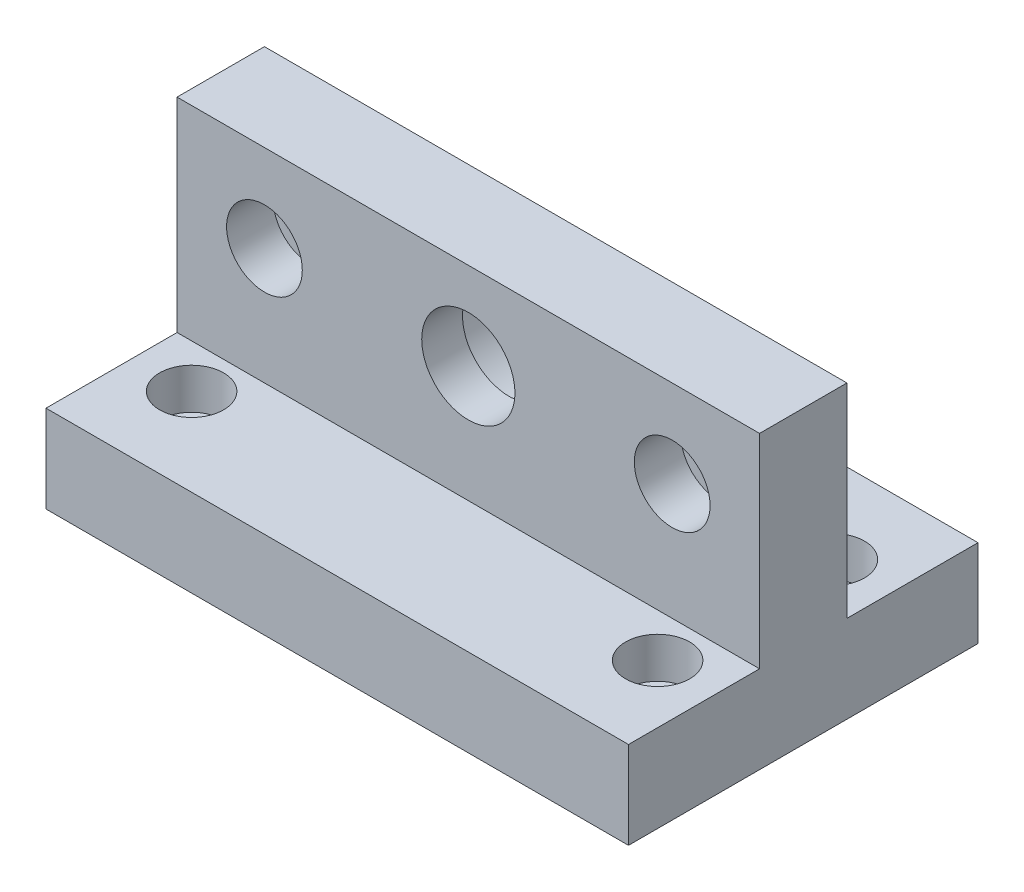
ISO-10303-21;
HEADER;
FILE_DESCRIPTION(('STEP AP214'),'2;1');
FILE_NAME('part.step','',(''),(''),'','','');
FILE_SCHEMA(('AUTOMOTIVE_DESIGN { 1 0 10303 214 1 1 1 1 }'));
ENDSEC;
DATA;
#1=APPLICATION_CONTEXT('core data for automotive mechanical design processes');
#2=APPLICATION_PROTOCOL_DEFINITION('international standard','automotive_design',2000,#1);
#3=PRODUCT_CONTEXT('',#1,'mechanical');
#4=PRODUCT('Part','Part','',(#3));
#5=PRODUCT_RELATED_PRODUCT_CATEGORY('part','',(#4));
#6=PRODUCT_DEFINITION_FORMATION('','',#4);
#7=PRODUCT_DEFINITION_CONTEXT('part definition',#1,'design');
#8=PRODUCT_DEFINITION('design','',#6,#7);
#9=PRODUCT_DEFINITION_SHAPE('','',#8);
#10=(LENGTH_UNIT() NAMED_UNIT(*) SI_UNIT(.MILLI.,.METRE.));
#11=(NAMED_UNIT(*) PLANE_ANGLE_UNIT() SI_UNIT($,.RADIAN.));
#12=(NAMED_UNIT(*) SI_UNIT($,.STERADIAN.) SOLID_ANGLE_UNIT());
#13=UNCERTAINTY_MEASURE_WITH_UNIT(LENGTH_MEASURE(1.E-05),#10,'distance_accuracy_value','');
#14=(GEOMETRIC_REPRESENTATION_CONTEXT(3) GLOBAL_UNCERTAINTY_ASSIGNED_CONTEXT((#13)) GLOBAL_UNIT_ASSIGNED_CONTEXT((#10,
#11,#12)) REPRESENTATION_CONTEXT('',''));
#15=CARTESIAN_POINT('',(0.,0.,0.));
#16=DIRECTION('',(0.,0.,1.));
#17=DIRECTION('',(1.,0.,0.));
#18=AXIS2_PLACEMENT_3D('',#15,#16,#17);
#19=CARTESIAN_POINT('',(85.,20.,37.500025));
#20=DIRECTION('',(0.,0.,-1.));
#21=DIRECTION('',(-1.,0.,0.));
#22=AXIS2_PLACEMENT_3D('',#19,#20,#21);
#23=CYLINDRICAL_SURFACE('',#22,4.5);
#24=CARTESIAN_POINT('',(85.,20.,0.));
#25=DIRECTION('',(0.,0.,-1.));
#26=DIRECTION('',(-1.,0.,0.));
#27=AXIS2_PLACEMENT_3D('',#24,#25,#26);
#28=CIRCLE('',#27,4.5);
#29=CARTESIAN_POINT('',(80.5,20.,0.));
#30=VERTEX_POINT('',#29);
#31=EDGE_CURVE('E341',#30,#30,#28,.T.);
#32=ORIENTED_EDGE('',*,*,#31,.T.);
#33=EDGE_LOOP('',(#32));
#34=FACE_BOUND('',#33,.T.);
#35=CARTESIAN_POINT('',(85.,20.,7.));
#36=DIRECTION('',(0.,0.,1.));
#37=DIRECTION('',(1.,0.,0.));
#38=AXIS2_PLACEMENT_3D('',#35,#36,#37);
#39=CIRCLE('',#38,4.5);
#40=CARTESIAN_POINT('',(89.5,20.,7.));
#41=VERTEX_POINT('',#40);
#42=EDGE_CURVE('E40',#41,#41,#39,.F.);
#43=ORIENTED_EDGE('',*,*,#42,.F.);
#44=EDGE_LOOP('',(#43));
#45=FACE_BOUND('',#44,.T.);
#46=ADVANCED_FACE('F36',(#34,#45),#23,.F.);
#47=CARTESIAN_POINT('',(15.,20.,37.500025));
#48=DIRECTION('',(0.,0.,-1.));
#49=DIRECTION('',(-1.,0.,0.));
#50=AXIS2_PLACEMENT_3D('',#47,#48,#49);
#51=CYLINDRICAL_SURFACE('',#50,4.5);
#52=CARTESIAN_POINT('',(15.,20.,0.));
#53=DIRECTION('',(0.,0.,-1.));
#54=DIRECTION('',(-1.,0.,0.));
#55=AXIS2_PLACEMENT_3D('',#52,#53,#54);
#56=CIRCLE('',#55,4.5);
#57=CARTESIAN_POINT('',(10.5,20.,0.));
#58=VERTEX_POINT('',#57);
#59=EDGE_CURVE('E338',#58,#58,#56,.T.);
#60=ORIENTED_EDGE('',*,*,#59,.T.);
#61=EDGE_LOOP('',(#60));
#62=FACE_BOUND('',#61,.T.);
#63=CARTESIAN_POINT('',(15.,20.,7.));
#64=DIRECTION('',(0.,0.,1.));
#65=DIRECTION('',(1.,0.,0.));
#66=AXIS2_PLACEMENT_3D('',#63,#64,#65);
#67=CIRCLE('',#66,4.5);
#68=CARTESIAN_POINT('',(19.5,20.,7.));
#69=VERTEX_POINT('',#68);
#70=EDGE_CURVE('E315',#69,#69,#67,.F.);
#71=ORIENTED_EDGE('',*,*,#70,.F.);
#72=EDGE_LOOP('',(#71));
#73=FACE_BOUND('',#72,.T.);
#74=ADVANCED_FACE('F216',(#62,#73),#51,.F.);
#75=CARTESIAN_POINT('',(50.,20.,37.500025));
#76=DIRECTION('',(0.,0.,-1.));
#77=DIRECTION('',(-1.,0.,0.));
#78=AXIS2_PLACEMENT_3D('',#75,#76,#77);
#79=CYLINDRICAL_SURFACE('',#78,8.);
#80=CARTESIAN_POINT('',(50.,20.,15.));
#81=DIRECTION('',(0.,0.,-1.));
#82=DIRECTION('',(-1.,0.,0.));
#83=AXIS2_PLACEMENT_3D('',#80,#81,#82);
#84=CIRCLE('',#83,8.);
#85=CARTESIAN_POINT('',(42.,20.,15.));
#86=VERTEX_POINT('',#85);
#87=EDGE_CURVE('E313',#86,#86,#84,.T.);
#88=ORIENTED_EDGE('',*,*,#87,.F.);
#89=EDGE_LOOP('',(#88));
#90=FACE_BOUND('',#89,.T.);
#91=CARTESIAN_POINT('',(50.,20.,8.));
#92=DIRECTION('',(0.,0.,-1.));
#93=DIRECTION('',(-1.,0.,0.));
#94=AXIS2_PLACEMENT_3D('',#91,#92,#93);
#95=CIRCLE('',#94,8.);
#96=CARTESIAN_POINT('',(42.,20.,8.));
#97=VERTEX_POINT('',#96);
#98=EDGE_CURVE('E311',#97,#97,#95,.F.);
#99=ORIENTED_EDGE('',*,*,#98,.F.);
#100=EDGE_LOOP('',(#99));
#101=FACE_BOUND('',#100,.T.);
#102=ADVANCED_FACE('F222',(#90,#101),#79,.F.);
#103=CARTESIAN_POINT('',(90.,-15.,22.5));
#104=DIRECTION('',(0.,1.,0.));
#105=DIRECTION('',(0.,0.,1.));
#106=AXIS2_PLACEMENT_3D('',#103,#104,#105);
#107=CYLINDRICAL_SURFACE('',#106,3.50000000000001);
#108=CARTESIAN_POINT('',(90.,-15.,22.5));
#109=DIRECTION('',(0.,1.,0.));
#110=DIRECTION('',(0.,0.,-1.));
#111=AXIS2_PLACEMENT_3D('',#108,#109,#110);
#112=CIRCLE('',#111,3.50000000000001);
#113=CARTESIAN_POINT('',(90.,-15.,19.));
#114=VERTEX_POINT('',#113);
#115=EDGE_CURVE('E288',#114,#114,#112,.T.);
#116=ORIENTED_EDGE('',*,*,#115,.F.);
#117=EDGE_LOOP('',(#116));
#118=FACE_BOUND('',#117,.T.);
#119=CARTESIAN_POINT('',(90.,-7.,22.5));
#120=DIRECTION('',(0.,1.,0.));
#121=DIRECTION('',(0.,0.,1.));
#122=AXIS2_PLACEMENT_3D('',#119,#120,#121);
#123=CIRCLE('',#122,3.50000000000001);
#124=CARTESIAN_POINT('',(90.,-7.,26.));
#125=VERTEX_POINT('',#124);
#126=EDGE_CURVE('E306',#125,#125,#123,.F.);
#127=ORIENTED_EDGE('',*,*,#126,.F.);
#128=EDGE_LOOP('',(#127));
#129=FACE_BOUND('',#128,.T.);
#130=ADVANCED_FACE('F265',(#118,#129),#107,.F.);
#131=CARTESIAN_POINT('',(9.99999999999998,-15.,22.5));
#132=DIRECTION('',(0.,1.,0.));
#133=DIRECTION('',(0.,0.,1.));
#134=AXIS2_PLACEMENT_3D('',#131,#132,#133);
#135=CYLINDRICAL_SURFACE('',#134,3.5);
#136=CARTESIAN_POINT('',(9.99999999999998,-15.,22.5));
#137=DIRECTION('',(0.,1.,0.));
#138=DIRECTION('',(0.,0.,-1.));
#139=AXIS2_PLACEMENT_3D('',#136,#137,#138);
#140=CIRCLE('',#139,3.5);
#141=CARTESIAN_POINT('',(9.99999999999998,-15.,19.));
#142=VERTEX_POINT('',#141);
#143=EDGE_CURVE('E285',#142,#142,#140,.T.);
#144=ORIENTED_EDGE('',*,*,#143,.F.);
#145=EDGE_LOOP('',(#144));
#146=FACE_BOUND('',#145,.T.);
#147=CARTESIAN_POINT('',(9.99999999999998,-7.,22.5));
#148=DIRECTION('',(0.,1.,0.));
#149=DIRECTION('',(0.,0.,1.));
#150=AXIS2_PLACEMENT_3D('',#147,#148,#149);
#151=CIRCLE('',#150,3.5);
#152=CARTESIAN_POINT('',(9.99999999999998,-7.,26.));
#153=VERTEX_POINT('',#152);
#154=EDGE_CURVE('E301',#153,#153,#151,.F.);
#155=ORIENTED_EDGE('',*,*,#154,.F.);
#156=EDGE_LOOP('',(#155));
#157=FACE_BOUND('',#156,.T.);
#158=ADVANCED_FACE('F261',(#146,#157),#135,.F.);
#159=CARTESIAN_POINT('',(90.,-15.,-7.5));
#160=DIRECTION('',(0.,1.,0.));
#161=DIRECTION('',(0.,0.,1.));
#162=AXIS2_PLACEMENT_3D('',#159,#160,#161);
#163=CYLINDRICAL_SURFACE('',#162,3.50000000000001);
#164=CARTESIAN_POINT('',(90.,-15.,-7.5));
#165=DIRECTION('',(0.,1.,0.));
#166=DIRECTION('',(0.,0.,1.));
#167=AXIS2_PLACEMENT_3D('',#164,#165,#166);
#168=CIRCLE('',#167,3.50000000000001);
#169=CARTESIAN_POINT('',(90.,-15.,-3.99999999999999));
#170=VERTEX_POINT('',#169);
#171=EDGE_CURVE('E359',#170,#170,#168,.T.);
#172=ORIENTED_EDGE('',*,*,#171,.F.);
#173=EDGE_LOOP('',(#172));
#174=FACE_BOUND('',#173,.T.);
#175=CARTESIAN_POINT('',(90.,-7.,-7.5));
#176=DIRECTION('',(0.,1.,0.));
#177=DIRECTION('',(0.,0.,1.));
#178=AXIS2_PLACEMENT_3D('',#175,#176,#177);
#179=CIRCLE('',#178,3.50000000000001);
#180=CARTESIAN_POINT('',(90.,-7.,-3.99999999999999));
#181=VERTEX_POINT('',#180);
#182=EDGE_CURVE('E297',#181,#181,#179,.F.);
#183=ORIENTED_EDGE('',*,*,#182,.F.);
#184=EDGE_LOOP('',(#183));
#185=FACE_BOUND('',#184,.T.);
#186=ADVANCED_FACE('F264',(#174,#185),#163,.F.);
#187=CARTESIAN_POINT('',(10.,-15.,-7.5));
#188=DIRECTION('',(0.,1.,0.));
#189=DIRECTION('',(0.,0.,1.));
#190=AXIS2_PLACEMENT_3D('',#187,#188,#189);
#191=CYLINDRICAL_SURFACE('',#190,3.5);
#192=CARTESIAN_POINT('',(10.,-15.,-7.5));
#193=DIRECTION('',(0.,1.,0.));
#194=DIRECTION('',(0.,0.,1.));
#195=AXIS2_PLACEMENT_3D('',#192,#193,#194);
#196=CIRCLE('',#195,3.5);
#197=CARTESIAN_POINT('',(10.,-15.,-4.));
#198=VERTEX_POINT('',#197);
#199=EDGE_CURVE('E178',#198,#198,#196,.T.);
#200=ORIENTED_EDGE('',*,*,#199,.F.);
#201=EDGE_LOOP('',(#200));
#202=FACE_BOUND('',#201,.T.);
#203=CARTESIAN_POINT('',(10.,-7.,-7.5));
#204=DIRECTION('',(0.,1.,0.));
#205=DIRECTION('',(0.,0.,1.));
#206=AXIS2_PLACEMENT_3D('',#203,#204,#205);
#207=CIRCLE('',#206,3.5);
#208=CARTESIAN_POINT('',(10.,-7.,-4.));
#209=VERTEX_POINT('',#208);
#210=EDGE_CURVE('E283',#209,#209,#207,.F.);
#211=ORIENTED_EDGE('',*,*,#210,.F.);
#212=EDGE_LOOP('',(#211));
#213=FACE_BOUND('',#212,.T.);
#214=ADVANCED_FACE('F271',(#202,#213),#191,.F.);
#215=CARTESIAN_POINT('',(0.,0.,15.));
#216=DIRECTION('',(1.,0.,0.));
#217=DIRECTION('',(0.,0.,-1.));
#218=AXIS2_PLACEMENT_3D('',#215,#216,#217);
#219=PLANE('',#218);
#220=DIRECTION('',(0.,-1.,0.));
#221=VECTOR('',#220,1.);
#222=CARTESIAN_POINT('',(0.,0.,0.));
#223=LINE('',#222,#221);
#224=CARTESIAN_POINT('',(0.,35.,0.));
#225=VERTEX_POINT('',#224);
#226=CARTESIAN_POINT('',(0.,0.,0.));
#227=VERTEX_POINT('',#226);
#228=EDGE_CURVE('E118',#225,#227,#223,.T.);
#229=ORIENTED_EDGE('',*,*,#228,.T.);
#230=DIRECTION('',(0.,0.,-1.));
#231=VECTOR('',#230,1.);
#232=CARTESIAN_POINT('',(0.,0.,37.5));
#233=LINE('',#232,#231);
#234=CARTESIAN_POINT('',(0.,0.,-22.5));
#235=VERTEX_POINT('',#234);
#236=EDGE_CURVE('E149',#227,#235,#233,.T.);
#237=ORIENTED_EDGE('',*,*,#236,.T.);
#238=DIRECTION('',(0.,1.,0.));
#239=VECTOR('',#238,1.);
#240=CARTESIAN_POINT('',(0.,-15.,-22.5));
#241=LINE('',#240,#239);
#242=CARTESIAN_POINT('',(0.,-15.,-22.5));
#243=VERTEX_POINT('',#242);
#244=EDGE_CURVE('E132',#243,#235,#241,.T.);
#245=ORIENTED_EDGE('',*,*,#244,.F.);
#246=DIRECTION('',(0.,0.,-1.));
#247=VECTOR('',#246,1.);
#248=CARTESIAN_POINT('',(0.,-15.,37.5));
#249=LINE('',#248,#247);
#250=CARTESIAN_POINT('',(0.,-15.,37.5));
#251=VERTEX_POINT('',#250);
#252=EDGE_CURVE('E162',#251,#243,#249,.T.);
#253=ORIENTED_EDGE('',*,*,#252,.F.);
#254=DIRECTION('',(0.,1.,0.));
#255=VECTOR('',#254,1.);
#256=CARTESIAN_POINT('',(0.,-15.,37.5));
#257=LINE('',#256,#255);
#258=CARTESIAN_POINT('',(0.,0.,37.5));
#259=VERTEX_POINT('',#258);
#260=EDGE_CURVE('E183',#251,#259,#257,.T.);
#261=ORIENTED_EDGE('',*,*,#260,.T.);
#262=CARTESIAN_POINT('',(0.,0.,15.));
#263=VERTEX_POINT('',#262);
#264=EDGE_CURVE('E146',#259,#263,#233,.T.);
#265=ORIENTED_EDGE('',*,*,#264,.T.);
#266=DIRECTION('',(0.,-1.,0.));
#267=VECTOR('',#266,1.);
#268=CARTESIAN_POINT('',(0.,0.,15.));
#269=LINE('',#268,#267);
#270=CARTESIAN_POINT('',(0.,35.,15.));
#271=VERTEX_POINT('',#270);
#272=EDGE_CURVE('E103',#271,#263,#269,.T.);
#273=ORIENTED_EDGE('',*,*,#272,.F.);
#274=DIRECTION('',(0.,0.,-1.));
#275=VECTOR('',#274,1.);
#276=CARTESIAN_POINT('',(0.,35.,15.));
#277=LINE('',#276,#275);
#278=EDGE_CURVE('E46',#271,#225,#277,.T.);
#279=ORIENTED_EDGE('',*,*,#278,.T.);
#280=EDGE_LOOP('',(#229,#237,#245,#253,#261,#265,#273,#279));
#281=FACE_BOUND('',#280,.T.);
#282=ADVANCED_FACE('F38',(#281),#219,.F.);
#283=CARTESIAN_POINT('',(100.,0.,15.));
#284=DIRECTION('',(-1.,0.,0.));
#285=DIRECTION('',(0.,0.,1.));
#286=AXIS2_PLACEMENT_3D('',#283,#284,#285);
#287=PLANE('',#286);
#288=DIRECTION('',(0.,1.,0.));
#289=VECTOR('',#288,1.);
#290=CARTESIAN_POINT('',(100.,0.,0.));
#291=LINE('',#290,#289);
#292=CARTESIAN_POINT('',(100.,0.,0.));
#293=VERTEX_POINT('',#292);
#294=CARTESIAN_POINT('',(100.,35.,0.));
#295=VERTEX_POINT('',#294);
#296=EDGE_CURVE('E67',#293,#295,#291,.T.);
#297=ORIENTED_EDGE('',*,*,#296,.T.);
#298=DIRECTION('',(0.,0.,-1.));
#299=VECTOR('',#298,1.);
#300=CARTESIAN_POINT('',(100.,35.,15.));
#301=LINE('',#300,#299);
#302=CARTESIAN_POINT('',(100.,35.,15.));
#303=VERTEX_POINT('',#302);
#304=EDGE_CURVE('E11',#303,#295,#301,.T.);
#305=ORIENTED_EDGE('',*,*,#304,.F.);
#306=DIRECTION('',(0.,1.,0.));
#307=VECTOR('',#306,1.);
#308=CARTESIAN_POINT('',(100.,0.,15.));
#309=LINE('',#308,#307);
#310=CARTESIAN_POINT('',(100.,0.,15.));
#311=VERTEX_POINT('',#310);
#312=EDGE_CURVE('E101',#311,#303,#309,.T.);
#313=ORIENTED_EDGE('',*,*,#312,.F.);
#314=DIRECTION('',(0.,0.,1.));
#315=VECTOR('',#314,1.);
#316=CARTESIAN_POINT('',(100.,0.,37.5));
#317=LINE('',#316,#315);
#318=CARTESIAN_POINT('',(100.,0.,37.5));
#319=VERTEX_POINT('',#318);
#320=EDGE_CURVE('E85',#311,#319,#317,.T.);
#321=ORIENTED_EDGE('',*,*,#320,.T.);
#322=DIRECTION('',(0.,1.,0.));
#323=VECTOR('',#322,1.);
#324=CARTESIAN_POINT('',(100.,-15.,37.5));
#325=LINE('',#324,#323);
#326=CARTESIAN_POINT('',(100.,-15.,37.5));
#327=VERTEX_POINT('',#326);
#328=EDGE_CURVE('E142',#327,#319,#325,.T.);
#329=ORIENTED_EDGE('',*,*,#328,.F.);
#330=DIRECTION('',(0.,0.,1.));
#331=VECTOR('',#330,1.);
#332=CARTESIAN_POINT('',(100.,-15.,37.5));
#333=LINE('',#332,#331);
#334=CARTESIAN_POINT('',(100.,-15.,-22.5));
#335=VERTEX_POINT('',#334);
#336=EDGE_CURVE('E175',#335,#327,#333,.T.);
#337=ORIENTED_EDGE('',*,*,#336,.F.);
#338=DIRECTION('',(0.,1.,0.));
#339=VECTOR('',#338,1.);
#340=CARTESIAN_POINT('',(100.,-15.,-22.5));
#341=LINE('',#340,#339);
#342=CARTESIAN_POINT('',(100.,0.,-22.5));
#343=VERTEX_POINT('',#342);
#344=EDGE_CURVE('E134',#335,#343,#341,.T.);
#345=ORIENTED_EDGE('',*,*,#344,.T.);
#346=EDGE_CURVE('E97',#343,#293,#317,.T.);
#347=ORIENTED_EDGE('',*,*,#346,.T.);
#348=EDGE_LOOP('',(#297,#305,#313,#321,#329,#337,#345,#347));
#349=FACE_BOUND('',#348,.T.);
#350=ADVANCED_FACE('F105',(#349),#287,.F.);
#351=CARTESIAN_POINT('',(0.,35.,15.));
#352=DIRECTION('',(0.,-1.,0.));
#353=DIRECTION('',(0.,0.,-1.));
#354=AXIS2_PLACEMENT_3D('',#351,#352,#353);
#355=PLANE('',#354);
#356=DIRECTION('',(-1.,0.,0.));
#357=VECTOR('',#356,1.);
#358=CARTESIAN_POINT('',(0.,35.,0.));
#359=LINE('',#358,#357);
#360=EDGE_CURVE('E113',#295,#225,#359,.T.);
#361=ORIENTED_EDGE('',*,*,#360,.T.);
#362=ORIENTED_EDGE('',*,*,#278,.F.);
#363=DIRECTION('',(-1.,0.,0.));
#364=VECTOR('',#363,1.);
#365=CARTESIAN_POINT('',(0.,35.,15.));
#366=LINE('',#365,#364);
#367=EDGE_CURVE('E55',#303,#271,#366,.T.);
#368=ORIENTED_EDGE('',*,*,#367,.F.);
#369=ORIENTED_EDGE('',*,*,#304,.T.);
#370=EDGE_LOOP('',(#361,#362,#368,#369));
#371=FACE_BOUND('',#370,.T.);
#372=ADVANCED_FACE('F378',(#371),#355,.F.);
#373=CARTESIAN_POINT('',(0.,0.,15.));
#374=DIRECTION('',(0.,0.,-1.));
#375=DIRECTION('',(-1.,0.,0.));
#376=AXIS2_PLACEMENT_3D('',#373,#374,#375);
#377=PLANE('',#376);
#378=CARTESIAN_POINT('',(85.,20.,15.));
#379=DIRECTION('',(0.,0.,1.));
#380=DIRECTION('',(1.,0.,0.));
#381=AXIS2_PLACEMENT_3D('',#378,#379,#380);
#382=CIRCLE('',#381,6.5);
#383=CARTESIAN_POINT('',(91.5,20.,15.));
#384=VERTEX_POINT('',#383);
#385=EDGE_CURVE('E331',#384,#384,#382,.T.);
#386=ORIENTED_EDGE('',*,*,#385,.F.);
#387=EDGE_LOOP('',(#386));
#388=FACE_BOUND('',#387,.T.);
#389=CARTESIAN_POINT('',(15.,20.,15.));
#390=DIRECTION('',(0.,0.,1.));
#391=DIRECTION('',(1.,0.,0.));
#392=AXIS2_PLACEMENT_3D('',#389,#390,#391);
#393=CIRCLE('',#392,6.5);
#394=CARTESIAN_POINT('',(21.5,20.,15.));
#395=VERTEX_POINT('',#394);
#396=EDGE_CURVE('E324',#395,#395,#393,.T.);
#397=ORIENTED_EDGE('',*,*,#396,.F.);
#398=EDGE_LOOP('',(#397));
#399=FACE_BOUND('',#398,.T.);
#400=ORIENTED_EDGE('',*,*,#87,.T.);
#401=EDGE_LOOP('',(#400));
#402=FACE_BOUND('',#401,.T.);
#403=ORIENTED_EDGE('',*,*,#272,.T.);
#404=DIRECTION('',(1.,0.,0.));
#405=VECTOR('',#404,1.);
#406=CARTESIAN_POINT('',(0.,0.,15.));
#407=LINE('',#406,#405);
#408=EDGE_CURVE('E89',#263,#311,#407,.T.);
#409=ORIENTED_EDGE('',*,*,#408,.T.);
#410=ORIENTED_EDGE('',*,*,#312,.T.);
#411=ORIENTED_EDGE('',*,*,#367,.T.);
#412=EDGE_LOOP('',(#403,#409,#410,#411));
#413=FACE_BOUND('',#412,.T.);
#414=ADVANCED_FACE('F100',(#388,#399,#402,#413),#377,.F.);
#415=CARTESIAN_POINT('',(0.,0.,0.));
#416=DIRECTION('',(0.,0.,-1.));
#417=DIRECTION('',(-1.,0.,0.));
#418=AXIS2_PLACEMENT_3D('',#415,#416,#417);
#419=PLANE('',#418);
#420=CARTESIAN_POINT('',(50.,20.,0.));
#421=DIRECTION('',(0.,0.,-1.));
#422=DIRECTION('',(-1.,0.,0.));
#423=AXIS2_PLACEMENT_3D('',#420,#421,#422);
#424=CIRCLE('',#423,12.);
#425=CARTESIAN_POINT('',(38.,20.,0.));
#426=VERTEX_POINT('',#425);
#427=EDGE_CURVE('E317',#426,#426,#424,.T.);
#428=ORIENTED_EDGE('',*,*,#427,.F.);
#429=EDGE_LOOP('',(#428));
#430=FACE_BOUND('',#429,.T.);
#431=ORIENTED_EDGE('',*,*,#59,.F.);
#432=EDGE_LOOP('',(#431));
#433=FACE_BOUND('',#432,.T.);
#434=ORIENTED_EDGE('',*,*,#31,.F.);
#435=EDGE_LOOP('',(#434));
#436=FACE_BOUND('',#435,.T.);
#437=ORIENTED_EDGE('',*,*,#228,.F.);
#438=ORIENTED_EDGE('',*,*,#360,.F.);
#439=ORIENTED_EDGE('',*,*,#296,.F.);
#440=DIRECTION('',(1.,0.,0.));
#441=VECTOR('',#440,1.);
#442=CARTESIAN_POINT('',(0.,0.,0.));
#443=LINE('',#442,#441);
#444=EDGE_CURVE('E76',#227,#293,#443,.T.);
#445=ORIENTED_EDGE('',*,*,#444,.F.);
#446=EDGE_LOOP('',(#437,#438,#439,#445));
#447=FACE_BOUND('',#446,.T.);
#448=ADVANCED_FACE('F131',(#430,#433,#436,#447),#419,.T.);
#449=CARTESIAN_POINT('',(0.,0.,0.));
#450=DIRECTION('',(0.,-1.,0.));
#451=DIRECTION('',(0.,0.,-1.));
#452=AXIS2_PLACEMENT_3D('',#449,#450,#451);
#453=PLANE('',#452);
#454=CARTESIAN_POINT('',(90.,0.,-7.5));
#455=DIRECTION('',(0.,1.,0.));
#456=DIRECTION('',(0.,0.,1.));
#457=AXIS2_PLACEMENT_3D('',#454,#455,#456);
#458=CIRCLE('',#457,5.5);
#459=CARTESIAN_POINT('',(90.,0.,-2.));
#460=VERTEX_POINT('',#459);
#461=EDGE_CURVE('E304',#460,#460,#458,.T.);
#462=ORIENTED_EDGE('',*,*,#461,.F.);
#463=EDGE_LOOP('',(#462));
#464=FACE_BOUND('',#463,.T.);
#465=CARTESIAN_POINT('',(10.,0.,-7.5));
#466=DIRECTION('',(0.,1.,0.));
#467=DIRECTION('',(0.,0.,1.));
#468=AXIS2_PLACEMENT_3D('',#465,#466,#467);
#469=CIRCLE('',#468,5.5);
#470=CARTESIAN_POINT('',(10.,0.,-2.));
#471=VERTEX_POINT('',#470);
#472=EDGE_CURVE('E291',#471,#471,#469,.T.);
#473=ORIENTED_EDGE('',*,*,#472,.F.);
#474=EDGE_LOOP('',(#473));
#475=FACE_BOUND('',#474,.T.);
#476=ORIENTED_EDGE('',*,*,#236,.F.);
#477=ORIENTED_EDGE('',*,*,#444,.T.);
#478=ORIENTED_EDGE('',*,*,#346,.F.);
#479=DIRECTION('',(1.,0.,0.));
#480=VECTOR('',#479,1.);
#481=CARTESIAN_POINT('',(0.,0.,-22.5));
#482=LINE('',#481,#480);
#483=EDGE_CURVE('E98',#235,#343,#482,.T.);
#484=ORIENTED_EDGE('',*,*,#483,.F.);
#485=EDGE_LOOP('',(#476,#477,#478,#484));
#486=FACE_BOUND('',#485,.T.);
#487=ADVANCED_FACE('F210',(#464,#475,#486),#453,.F.);
#488=CARTESIAN_POINT('',(0.,-15.,-22.5));
#489=DIRECTION('',(0.,0.,1.));
#490=DIRECTION('',(1.,0.,0.));
#491=AXIS2_PLACEMENT_3D('',#488,#489,#490);
#492=PLANE('',#491);
#493=ORIENTED_EDGE('',*,*,#483,.T.);
#494=ORIENTED_EDGE('',*,*,#344,.F.);
#495=DIRECTION('',(1.,0.,0.));
#496=VECTOR('',#495,1.);
#497=CARTESIAN_POINT('',(0.,-15.,-22.5));
#498=LINE('',#497,#496);
#499=EDGE_CURVE('E168',#243,#335,#498,.T.);
#500=ORIENTED_EDGE('',*,*,#499,.F.);
#501=ORIENTED_EDGE('',*,*,#244,.T.);
#502=EDGE_LOOP('',(#493,#494,#500,#501));
#503=FACE_BOUND('',#502,.T.);
#504=ADVANCED_FACE('F198',(#503),#492,.F.);
#505=CARTESIAN_POINT('',(0.,-15.,37.5));
#506=DIRECTION('',(0.,0.,-1.));
#507=DIRECTION('',(-1.,0.,0.));
#508=AXIS2_PLACEMENT_3D('',#505,#506,#507);
#509=PLANE('',#508);
#510=DIRECTION('',(-1.,0.,0.));
#511=VECTOR('',#510,1.);
#512=CARTESIAN_POINT('',(0.,0.,37.5));
#513=LINE('',#512,#511);
#514=EDGE_CURVE('E93',#319,#259,#513,.T.);
#515=ORIENTED_EDGE('',*,*,#514,.T.);
#516=ORIENTED_EDGE('',*,*,#260,.F.);
#517=DIRECTION('',(-1.,0.,0.));
#518=VECTOR('',#517,1.);
#519=CARTESIAN_POINT('',(0.,-15.,37.5));
#520=LINE('',#519,#518);
#521=EDGE_CURVE('E154',#327,#251,#520,.T.);
#522=ORIENTED_EDGE('',*,*,#521,.F.);
#523=ORIENTED_EDGE('',*,*,#328,.T.);
#524=EDGE_LOOP('',(#515,#516,#522,#523));
#525=FACE_BOUND('',#524,.T.);
#526=ADVANCED_FACE('F186',(#525),#509,.F.);
#527=CARTESIAN_POINT('',(0.,-15.,0.));
#528=DIRECTION('',(0.,-1.,0.));
#529=DIRECTION('',(0.,0.,-1.));
#530=AXIS2_PLACEMENT_3D('',#527,#528,#529);
#531=PLANE('',#530);
#532=ORIENTED_EDGE('',*,*,#143,.T.);
#533=EDGE_LOOP('',(#532));
#534=FACE_BOUND('',#533,.T.);
#535=ORIENTED_EDGE('',*,*,#115,.T.);
#536=EDGE_LOOP('',(#535));
#537=FACE_BOUND('',#536,.T.);
#538=ORIENTED_EDGE('',*,*,#171,.T.);
#539=EDGE_LOOP('',(#538));
#540=FACE_BOUND('',#539,.T.);
#541=ORIENTED_EDGE('',*,*,#199,.T.);
#542=EDGE_LOOP('',(#541));
#543=FACE_BOUND('',#542,.T.);
#544=ORIENTED_EDGE('',*,*,#252,.T.);
#545=ORIENTED_EDGE('',*,*,#499,.T.);
#546=ORIENTED_EDGE('',*,*,#336,.T.);
#547=ORIENTED_EDGE('',*,*,#521,.T.);
#548=EDGE_LOOP('',(#544,#545,#546,#547));
#549=FACE_BOUND('',#548,.T.);
#550=ADVANCED_FACE('F199',(#534,#537,#540,#543,#549),#531,.T.);
#551=CARTESIAN_POINT('',(90.,0.,22.5));
#552=DIRECTION('',(0.,1.,0.));
#553=DIRECTION('',(0.,0.,1.));
#554=AXIS2_PLACEMENT_3D('',#551,#552,#553);
#555=CIRCLE('',#554,5.5);
#556=CARTESIAN_POINT('',(90.,0.,28.));
#557=VERTEX_POINT('',#556);
#558=EDGE_CURVE('E343',#557,#557,#555,.T.);
#559=ORIENTED_EDGE('',*,*,#558,.F.);
#560=EDGE_LOOP('',(#559));
#561=FACE_BOUND('',#560,.T.);
#562=CARTESIAN_POINT('',(9.99999999999998,0.,22.5));
#563=DIRECTION('',(0.,1.,0.));
#564=DIRECTION('',(0.,0.,1.));
#565=AXIS2_PLACEMENT_3D('',#562,#563,#564);
#566=CIRCLE('',#565,5.5);
#567=CARTESIAN_POINT('',(9.99999999999998,0.,28.));
#568=VERTEX_POINT('',#567);
#569=EDGE_CURVE('E309',#568,#568,#566,.T.);
#570=ORIENTED_EDGE('',*,*,#569,.F.);
#571=EDGE_LOOP('',(#570));
#572=FACE_BOUND('',#571,.T.);
#573=ORIENTED_EDGE('',*,*,#408,.F.);
#574=ORIENTED_EDGE('',*,*,#264,.F.);
#575=ORIENTED_EDGE('',*,*,#514,.F.);
#576=ORIENTED_EDGE('',*,*,#320,.F.);
#577=EDGE_LOOP('',(#573,#574,#575,#576));
#578=FACE_BOUND('',#577,.T.);
#579=ADVANCED_FACE('F87',(#561,#572,#578),#453,.F.);
#580=CARTESIAN_POINT('',(10.,-7.,-7.5));
#581=DIRECTION('',(0.,1.,0.));
#582=DIRECTION('',(0.,0.,1.));
#583=AXIS2_PLACEMENT_3D('',#580,#581,#582);
#584=PLANE('',#583);
#585=CARTESIAN_POINT('',(10.,-7.,-7.5));
#586=DIRECTION('',(0.,1.,0.));
#587=DIRECTION('',(0.,0.,1.));
#588=AXIS2_PLACEMENT_3D('',#585,#586,#587);
#589=CIRCLE('',#588,5.5);
#590=CARTESIAN_POINT('',(10.,-7.,-2.));
#591=VERTEX_POINT('',#590);
#592=EDGE_CURVE('E286',#591,#591,#589,.T.);
#593=ORIENTED_EDGE('',*,*,#592,.T.);
#594=EDGE_LOOP('',(#593));
#595=FACE_BOUND('',#594,.T.);
#596=ORIENTED_EDGE('',*,*,#210,.T.);
#597=EDGE_LOOP('',(#596));
#598=FACE_BOUND('',#597,.T.);
#599=ADVANCED_FACE('F207',(#595,#598),#584,.T.);
#600=CARTESIAN_POINT('',(10.,-7.,-7.5));
#601=DIRECTION('',(0.,1.,0.));
#602=DIRECTION('',(0.,0.,1.));
#603=AXIS2_PLACEMENT_3D('',#600,#601,#602);
#604=CYLINDRICAL_SURFACE('',#603,5.5);
#605=ORIENTED_EDGE('',*,*,#592,.F.);
#606=EDGE_LOOP('',(#605));
#607=FACE_BOUND('',#606,.T.);
#608=ORIENTED_EDGE('',*,*,#472,.T.);
#609=EDGE_LOOP('',(#608));
#610=FACE_BOUND('',#609,.T.);
#611=ADVANCED_FACE('F250',(#607,#610),#604,.F.);
#612=CARTESIAN_POINT('',(90.,-7.,-7.5));
#613=DIRECTION('',(0.,1.,0.));
#614=DIRECTION('',(0.,0.,1.));
#615=AXIS2_PLACEMENT_3D('',#612,#613,#614);
#616=PLANE('',#615);
#617=CARTESIAN_POINT('',(90.,-7.,-7.5));
#618=DIRECTION('',(0.,1.,0.));
#619=DIRECTION('',(0.,0.,1.));
#620=AXIS2_PLACEMENT_3D('',#617,#618,#619);
#621=CIRCLE('',#620,5.5);
#622=CARTESIAN_POINT('',(90.,-7.,-2.));
#623=VERTEX_POINT('',#622);
#624=EDGE_CURVE('E300',#623,#623,#621,.T.);
#625=ORIENTED_EDGE('',*,*,#624,.T.);
#626=EDGE_LOOP('',(#625));
#627=FACE_BOUND('',#626,.T.);
#628=ORIENTED_EDGE('',*,*,#182,.T.);
#629=EDGE_LOOP('',(#628));
#630=FACE_BOUND('',#629,.T.);
#631=ADVANCED_FACE('F247',(#627,#630),#616,.T.);
#632=CARTESIAN_POINT('',(90.,-7.,-7.5));
#633=DIRECTION('',(0.,1.,0.));
#634=DIRECTION('',(0.,0.,1.));
#635=AXIS2_PLACEMENT_3D('',#632,#633,#634);
#636=CYLINDRICAL_SURFACE('',#635,5.5);
#637=ORIENTED_EDGE('',*,*,#624,.F.);
#638=EDGE_LOOP('',(#637));
#639=FACE_BOUND('',#638,.T.);
#640=ORIENTED_EDGE('',*,*,#461,.T.);
#641=EDGE_LOOP('',(#640));
#642=FACE_BOUND('',#641,.T.);
#643=ADVANCED_FACE('F242',(#639,#642),#636,.F.);
#644=CARTESIAN_POINT('',(9.99999999999998,-7.,22.5));
#645=DIRECTION('',(0.,1.,0.));
#646=DIRECTION('',(0.,0.,1.));
#647=AXIS2_PLACEMENT_3D('',#644,#645,#646);
#648=PLANE('',#647);
#649=CARTESIAN_POINT('',(9.99999999999998,-7.,22.5));
#650=DIRECTION('',(0.,1.,0.));
#651=DIRECTION('',(0.,0.,1.));
#652=AXIS2_PLACEMENT_3D('',#649,#650,#651);
#653=CIRCLE('',#652,5.5);
#654=CARTESIAN_POINT('',(9.99999999999998,-7.,28.));
#655=VERTEX_POINT('',#654);
#656=EDGE_CURVE('E305',#655,#655,#653,.T.);
#657=ORIENTED_EDGE('',*,*,#656,.T.);
#658=EDGE_LOOP('',(#657));
#659=FACE_BOUND('',#658,.T.);
#660=ORIENTED_EDGE('',*,*,#154,.T.);
#661=EDGE_LOOP('',(#660));
#662=FACE_BOUND('',#661,.T.);
#663=ADVANCED_FACE('F239',(#659,#662),#648,.T.);
#664=CARTESIAN_POINT('',(9.99999999999998,-7.,22.5));
#665=DIRECTION('',(0.,1.,0.));
#666=DIRECTION('',(0.,0.,1.));
#667=AXIS2_PLACEMENT_3D('',#664,#665,#666);
#668=CYLINDRICAL_SURFACE('',#667,5.5);
#669=ORIENTED_EDGE('',*,*,#656,.F.);
#670=EDGE_LOOP('',(#669));
#671=FACE_BOUND('',#670,.T.);
#672=ORIENTED_EDGE('',*,*,#569,.T.);
#673=EDGE_LOOP('',(#672));
#674=FACE_BOUND('',#673,.T.);
#675=ADVANCED_FACE('F233',(#671,#674),#668,.F.);
#676=CARTESIAN_POINT('',(90.,-7.,22.5));
#677=DIRECTION('',(0.,1.,0.));
#678=DIRECTION('',(0.,0.,1.));
#679=AXIS2_PLACEMENT_3D('',#676,#677,#678);
#680=PLANE('',#679);
#681=CARTESIAN_POINT('',(90.,-7.,22.5));
#682=DIRECTION('',(0.,1.,0.));
#683=DIRECTION('',(0.,0.,1.));
#684=AXIS2_PLACEMENT_3D('',#681,#682,#683);
#685=CIRCLE('',#684,5.5);
#686=CARTESIAN_POINT('',(90.,-7.,28.));
#687=VERTEX_POINT('',#686);
#688=EDGE_CURVE('E310',#687,#687,#685,.T.);
#689=ORIENTED_EDGE('',*,*,#688,.T.);
#690=EDGE_LOOP('',(#689));
#691=FACE_BOUND('',#690,.T.);
#692=ORIENTED_EDGE('',*,*,#126,.T.);
#693=EDGE_LOOP('',(#692));
#694=FACE_BOUND('',#693,.T.);
#695=ADVANCED_FACE('F229',(#691,#694),#680,.T.);
#696=CARTESIAN_POINT('',(90.,-7.,22.5));
#697=DIRECTION('',(0.,1.,0.));
#698=DIRECTION('',(0.,0.,1.));
#699=AXIS2_PLACEMENT_3D('',#696,#697,#698);
#700=CYLINDRICAL_SURFACE('',#699,5.5);
#701=ORIENTED_EDGE('',*,*,#688,.F.);
#702=EDGE_LOOP('',(#701));
#703=FACE_BOUND('',#702,.T.);
#704=ORIENTED_EDGE('',*,*,#558,.T.);
#705=EDGE_LOOP('',(#704));
#706=FACE_BOUND('',#705,.T.);
#707=ADVANCED_FACE('F232',(#703,#706),#700,.F.);
#708=CARTESIAN_POINT('',(50.,20.,8.));
#709=DIRECTION('',(0.,0.,-1.));
#710=DIRECTION('',(-1.,0.,0.));
#711=AXIS2_PLACEMENT_3D('',#708,#709,#710);
#712=PLANE('',#711);
#713=CARTESIAN_POINT('',(50.,20.,8.));
#714=DIRECTION('',(0.,0.,-1.));
#715=DIRECTION('',(-1.,0.,0.));
#716=AXIS2_PLACEMENT_3D('',#713,#714,#715);
#717=CIRCLE('',#716,12.);
#718=CARTESIAN_POINT('',(38.,20.,8.));
#719=VERTEX_POINT('',#718);
#720=EDGE_CURVE('E314',#719,#719,#717,.T.);
#721=ORIENTED_EDGE('',*,*,#720,.T.);
#722=EDGE_LOOP('',(#721));
#723=FACE_BOUND('',#722,.T.);
#724=ORIENTED_EDGE('',*,*,#98,.T.);
#725=EDGE_LOOP('',(#724));
#726=FACE_BOUND('',#725,.T.);
#727=ADVANCED_FACE('F237',(#723,#726),#712,.T.);
#728=CARTESIAN_POINT('',(50.,20.,8.));
#729=DIRECTION('',(0.,0.,-1.));
#730=DIRECTION('',(-1.,0.,0.));
#731=AXIS2_PLACEMENT_3D('',#728,#729,#730);
#732=CYLINDRICAL_SURFACE('',#731,12.);
#733=ORIENTED_EDGE('',*,*,#720,.F.);
#734=EDGE_LOOP('',(#733));
#735=FACE_BOUND('',#734,.T.);
#736=ORIENTED_EDGE('',*,*,#427,.T.);
#737=EDGE_LOOP('',(#736));
#738=FACE_BOUND('',#737,.T.);
#739=ADVANCED_FACE('F485',(#735,#738),#732,.F.);
#740=CARTESIAN_POINT('',(15.,20.,7.));
#741=DIRECTION('',(0.,0.,1.));
#742=DIRECTION('',(1.,0.,0.));
#743=AXIS2_PLACEMENT_3D('',#740,#741,#742);
#744=PLANE('',#743);
#745=CARTESIAN_POINT('',(15.,20.,7.));
#746=DIRECTION('',(0.,0.,1.));
#747=DIRECTION('',(1.,0.,0.));
#748=AXIS2_PLACEMENT_3D('',#745,#746,#747);
#749=CIRCLE('',#748,6.5);
#750=CARTESIAN_POINT('',(21.5,20.,7.));
#751=VERTEX_POINT('',#750);
#752=EDGE_CURVE('E318',#751,#751,#749,.T.);
#753=ORIENTED_EDGE('',*,*,#752,.T.);
#754=EDGE_LOOP('',(#753));
#755=FACE_BOUND('',#754,.T.);
#756=ORIENTED_EDGE('',*,*,#70,.T.);
#757=EDGE_LOOP('',(#756));
#758=FACE_BOUND('',#757,.T.);
#759=ADVANCED_FACE('F495',(#755,#758),#744,.T.);
#760=CARTESIAN_POINT('',(15.,20.,7.));
#761=DIRECTION('',(0.,0.,1.));
#762=DIRECTION('',(1.,0.,0.));
#763=AXIS2_PLACEMENT_3D('',#760,#761,#762);
#764=CYLINDRICAL_SURFACE('',#763,6.5);
#765=ORIENTED_EDGE('',*,*,#752,.F.);
#766=EDGE_LOOP('',(#765));
#767=FACE_BOUND('',#766,.T.);
#768=ORIENTED_EDGE('',*,*,#396,.T.);
#769=EDGE_LOOP('',(#768));
#770=FACE_BOUND('',#769,.T.);
#771=ADVANCED_FACE('F506',(#767,#770),#764,.F.);
#772=CARTESIAN_POINT('',(85.,20.,7.));
#773=DIRECTION('',(0.,0.,1.));
#774=DIRECTION('',(1.,0.,0.));
#775=AXIS2_PLACEMENT_3D('',#772,#773,#774);
#776=PLANE('',#775);
#777=CARTESIAN_POINT('',(85.,20.,7.));
#778=DIRECTION('',(0.,0.,1.));
#779=DIRECTION('',(1.,0.,0.));
#780=AXIS2_PLACEMENT_3D('',#777,#778,#779);
#781=CIRCLE('',#780,6.5);
#782=CARTESIAN_POINT('',(91.5,20.,7.));
#783=VERTEX_POINT('',#782);
#784=EDGE_CURVE('E661',#783,#783,#781,.T.);
#785=ORIENTED_EDGE('',*,*,#784,.T.);
#786=EDGE_LOOP('',(#785));
#787=FACE_BOUND('',#786,.T.);
#788=ORIENTED_EDGE('',*,*,#42,.T.);
#789=EDGE_LOOP('',(#788));
#790=FACE_BOUND('',#789,.T.);
#791=ADVANCED_FACE('F515',(#787,#790),#776,.T.);
#792=CARTESIAN_POINT('',(85.,20.,7.));
#793=DIRECTION('',(0.,0.,1.));
#794=DIRECTION('',(1.,0.,0.));
#795=AXIS2_PLACEMENT_3D('',#792,#793,#794);
#796=CYLINDRICAL_SURFACE('',#795,6.5);
#797=ORIENTED_EDGE('',*,*,#784,.F.);
#798=EDGE_LOOP('',(#797));
#799=FACE_BOUND('',#798,.T.);
#800=ORIENTED_EDGE('',*,*,#385,.T.);
#801=EDGE_LOOP('',(#800));
#802=FACE_BOUND('',#801,.T.);
#803=ADVANCED_FACE('F525',(#799,#802),#796,.F.);
#804=CLOSED_SHELL('',(#46,#74,#102,#130,#158,#186,#214,#282,#350,#372,#414,#448,#487,#504,#526,
#550,#579,#599,#611,#631,#643,#663,#675,#695,#707,#727,#739,#759,#771,#791,#803));
#805=MANIFOLD_SOLID_BREP('B2',#804);
#806=ADVANCED_BREP_SHAPE_REPRESENTATION('',(#18,#805),#14);
#807=SHAPE_DEFINITION_REPRESENTATION(#9,#806);
ENDSEC;
END-ISO-10303-21;
